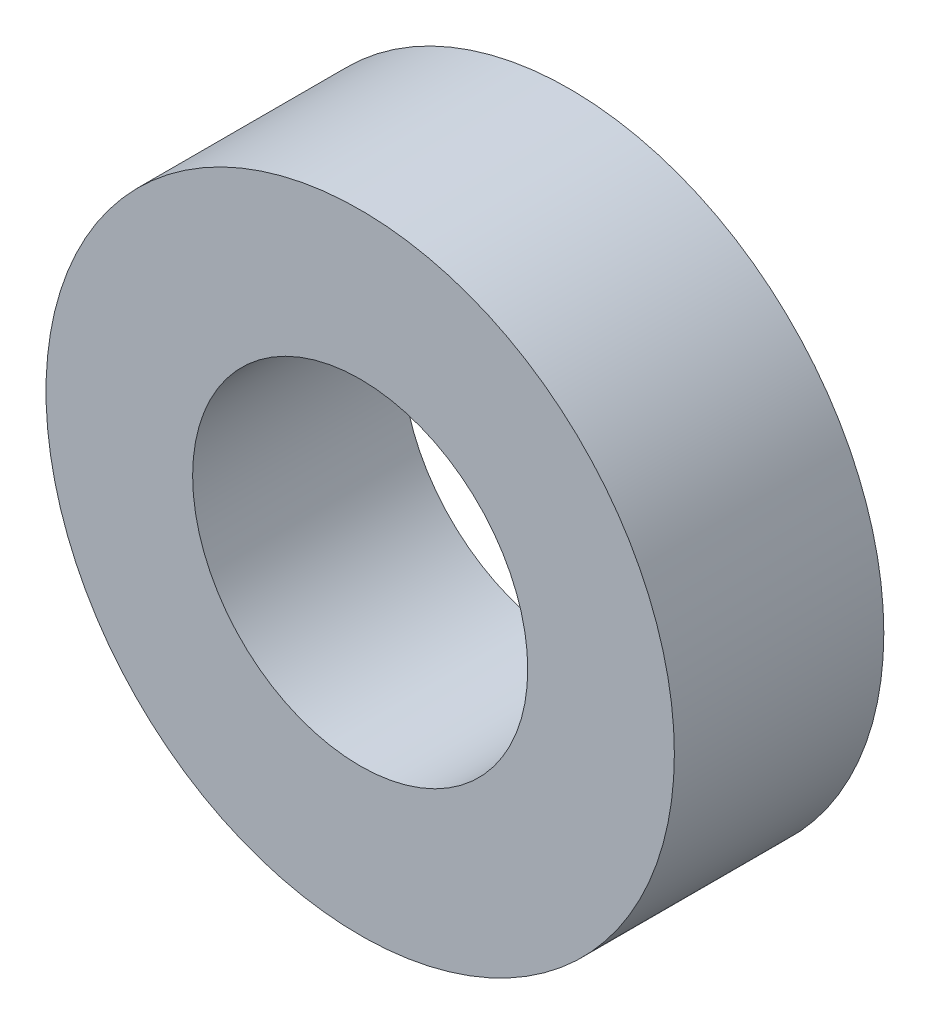
ISO-10303-21;
HEADER;
FILE_DESCRIPTION(('STEP AP214'),'2;1');
FILE_NAME('part.step','',(''),(''),'','','');
FILE_SCHEMA(('AUTOMOTIVE_DESIGN { 1 0 10303 214 1 1 1 1 }'));
ENDSEC;
DATA;
#1=APPLICATION_CONTEXT('core data for automotive mechanical design processes');
#2=APPLICATION_PROTOCOL_DEFINITION('international standard','automotive_design',2000,#1);
#3=PRODUCT_CONTEXT('',#1,'mechanical');
#4=PRODUCT('Part','Part','',(#3));
#5=PRODUCT_RELATED_PRODUCT_CATEGORY('part','',(#4));
#6=PRODUCT_DEFINITION_FORMATION('','',#4);
#7=PRODUCT_DEFINITION_CONTEXT('part definition',#1,'design');
#8=PRODUCT_DEFINITION('design','',#6,#7);
#9=PRODUCT_DEFINITION_SHAPE('','',#8);
#10=(LENGTH_UNIT() NAMED_UNIT(*) SI_UNIT(.MILLI.,.METRE.));
#11=(NAMED_UNIT(*) PLANE_ANGLE_UNIT() SI_UNIT($,.RADIAN.));
#12=(NAMED_UNIT(*) SI_UNIT($,.STERADIAN.) SOLID_ANGLE_UNIT());
#13=UNCERTAINTY_MEASURE_WITH_UNIT(LENGTH_MEASURE(1.E-05),#10,'distance_accuracy_value','');
#14=(GEOMETRIC_REPRESENTATION_CONTEXT(3) GLOBAL_UNCERTAINTY_ASSIGNED_CONTEXT((#13)) GLOBAL_UNIT_ASSIGNED_CONTEXT((#10,
#11,#12)) REPRESENTATION_CONTEXT('',''));
#15=CARTESIAN_POINT('',(0.,0.,0.));
#16=DIRECTION('',(0.,0.,1.));
#17=DIRECTION('',(1.,0.,0.));
#18=AXIS2_PLACEMENT_3D('',#15,#16,#17);
#19=CARTESIAN_POINT('',(0.,0.,5.));
#20=DIRECTION('',(0.,0.,1.));
#21=DIRECTION('',(1.,0.,0.));
#22=AXIS2_PLACEMENT_3D('',#19,#20,#21);
#23=PLANE('',#22);
#24=CARTESIAN_POINT('',(0.,0.,5.));
#25=DIRECTION('',(0.,0.,1.));
#26=DIRECTION('',(1.,0.,0.));
#27=AXIS2_PLACEMENT_3D('',#24,#25,#26);
#28=CIRCLE('',#27,7.5);
#29=CARTESIAN_POINT('',(7.5,0.,5.));
#30=VERTEX_POINT('',#29);
#31=EDGE_CURVE('E10',#30,#30,#28,.T.);
#32=ORIENTED_EDGE('',*,*,#31,.T.);
#33=EDGE_LOOP('',(#32));
#34=FACE_BOUND('',#33,.T.);
#35=CARTESIAN_POINT('',(0.,0.,5.));
#36=DIRECTION('',(0.,0.,1.));
#37=DIRECTION('',(1.,0.,0.));
#38=AXIS2_PLACEMENT_3D('',#35,#36,#37);
#39=CIRCLE('',#38,4.);
#40=CARTESIAN_POINT('',(4.,0.,5.));
#41=VERTEX_POINT('',#40);
#42=EDGE_CURVE('E42',#41,#41,#39,.T.);
#43=ORIENTED_EDGE('',*,*,#42,.F.);
#44=EDGE_LOOP('',(#43));
#45=FACE_BOUND('',#44,.T.);
#46=ADVANCED_FACE('F31',(#34,#45),#23,.T.);
#47=CARTESIAN_POINT('',(0.,0.,0.));
#48=DIRECTION('',(0.,0.,1.));
#49=DIRECTION('',(1.,0.,0.));
#50=AXIS2_PLACEMENT_3D('',#47,#48,#49);
#51=PLANE('',#50);
#52=CARTESIAN_POINT('',(0.,0.,0.));
#53=DIRECTION('',(0.,0.,1.));
#54=DIRECTION('',(1.,0.,0.));
#55=AXIS2_PLACEMENT_3D('',#52,#53,#54);
#56=CIRCLE('',#55,7.5);
#57=CARTESIAN_POINT('',(7.5,0.,0.));
#58=VERTEX_POINT('',#57);
#59=EDGE_CURVE('E35',#58,#58,#56,.T.);
#60=ORIENTED_EDGE('',*,*,#59,.F.);
#61=EDGE_LOOP('',(#60));
#62=FACE_BOUND('',#61,.T.);
#63=CARTESIAN_POINT('',(0.,0.,0.));
#64=DIRECTION('',(0.,0.,1.));
#65=DIRECTION('',(1.,0.,0.));
#66=AXIS2_PLACEMENT_3D('',#63,#64,#65);
#67=CIRCLE('',#66,4.);
#68=CARTESIAN_POINT('',(4.,0.,0.));
#69=VERTEX_POINT('',#68);
#70=EDGE_CURVE('E44',#69,#69,#67,.T.);
#71=ORIENTED_EDGE('',*,*,#70,.T.);
#72=EDGE_LOOP('',(#71));
#73=FACE_BOUND('',#72,.T.);
#74=ADVANCED_FACE('F54',(#62,#73),#51,.F.);
#75=CARTESIAN_POINT('',(0.,0.,5.));
#76=DIRECTION('',(0.,0.,-1.));
#77=DIRECTION('',(-1.,0.,0.));
#78=AXIS2_PLACEMENT_3D('',#75,#76,#77);
#79=CYLINDRICAL_SURFACE('',#78,7.5);
#80=ORIENTED_EDGE('',*,*,#31,.F.);
#81=EDGE_LOOP('',(#80));
#82=FACE_BOUND('',#81,.T.);
#83=ORIENTED_EDGE('',*,*,#59,.T.);
#84=EDGE_LOOP('',(#83));
#85=FACE_BOUND('',#84,.T.);
#86=ADVANCED_FACE('F33',(#82,#85),#79,.T.);
#87=CARTESIAN_POINT('',(0.,0.,5.));
#88=DIRECTION('',(0.,0.,-1.));
#89=DIRECTION('',(-1.,0.,0.));
#90=AXIS2_PLACEMENT_3D('',#87,#88,#89);
#91=CYLINDRICAL_SURFACE('',#90,4.);
#92=ORIENTED_EDGE('',*,*,#42,.T.);
#93=EDGE_LOOP('',(#92));
#94=FACE_BOUND('',#93,.T.);
#95=ORIENTED_EDGE('',*,*,#70,.F.);
#96=EDGE_LOOP('',(#95));
#97=FACE_BOUND('',#96,.T.);
#98=ADVANCED_FACE('F50',(#94,#97),#91,.F.);
#99=CLOSED_SHELL('',(#46,#74,#86,#98));
#100=MANIFOLD_SOLID_BREP('B2',#99);
#101=ADVANCED_BREP_SHAPE_REPRESENTATION('',(#18,#100),#14);
#102=SHAPE_DEFINITION_REPRESENTATION(#9,#101);
ENDSEC;
END-ISO-10303-21;
